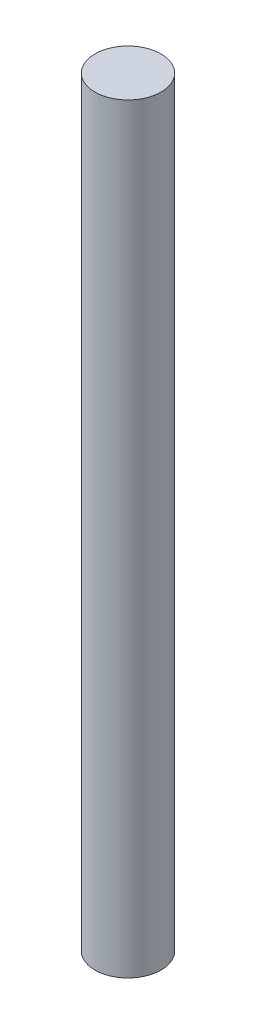
ISO-10303-21;
HEADER;
FILE_DESCRIPTION(('STEP AP214'),'2;1');
FILE_NAME('part.step','',(''),(''),'','','');
FILE_SCHEMA(('AUTOMOTIVE_DESIGN { 1 0 10303 214 1 1 1 1 }'));
ENDSEC;
DATA;
#1=APPLICATION_CONTEXT('core data for automotive mechanical design processes');
#2=APPLICATION_PROTOCOL_DEFINITION('international standard','automotive_design',2000,#1);
#3=PRODUCT_CONTEXT('',#1,'mechanical');
#4=PRODUCT('Part','Part','',(#3));
#5=PRODUCT_RELATED_PRODUCT_CATEGORY('part','',(#4));
#6=PRODUCT_DEFINITION_FORMATION('','',#4);
#7=PRODUCT_DEFINITION_CONTEXT('part definition',#1,'design');
#8=PRODUCT_DEFINITION('design','',#6,#7);
#9=PRODUCT_DEFINITION_SHAPE('','',#8);
#10=(LENGTH_UNIT() NAMED_UNIT(*) SI_UNIT(.MILLI.,.METRE.));
#11=(NAMED_UNIT(*) PLANE_ANGLE_UNIT() SI_UNIT($,.RADIAN.));
#12=(NAMED_UNIT(*) SI_UNIT($,.STERADIAN.) SOLID_ANGLE_UNIT());
#13=UNCERTAINTY_MEASURE_WITH_UNIT(LENGTH_MEASURE(1.E-05),#10,'distance_accuracy_value','');
#14=(GEOMETRIC_REPRESENTATION_CONTEXT(3) GLOBAL_UNCERTAINTY_ASSIGNED_CONTEXT((#13)) GLOBAL_UNIT_ASSIGNED_CONTEXT((#10,
#11,#12)) REPRESENTATION_CONTEXT('',''));
#15=CARTESIAN_POINT('',(0.,0.,0.));
#16=DIRECTION('',(0.,0.,1.));
#17=DIRECTION('',(1.,0.,0.));
#18=AXIS2_PLACEMENT_3D('',#15,#16,#17);
#19=CARTESIAN_POINT('',(0.,73.025,0.));
#20=DIRECTION('',(0.,-1.,0.));
#21=DIRECTION('',(0.,0.,-1.));
#22=AXIS2_PLACEMENT_3D('',#19,#20,#21);
#23=CYLINDRICAL_SURFACE('',#22,6.35);
#24=CARTESIAN_POINT('',(0.,73.025,0.));
#25=DIRECTION('',(0.,1.,0.));
#26=DIRECTION('',(0.,0.,1.));
#27=AXIS2_PLACEMENT_3D('',#24,#25,#26);
#28=CIRCLE('',#27,6.35);
#29=CARTESIAN_POINT('',(0.,73.025,6.35));
#30=VERTEX_POINT('',#29);
#31=EDGE_CURVE('E10',#30,#30,#28,.T.);
#32=ORIENTED_EDGE('',*,*,#31,.F.);
#33=EDGE_LOOP('',(#32));
#34=FACE_BOUND('',#33,.T.);
#35=CARTESIAN_POINT('',(0.,-73.025,0.));
#36=DIRECTION('',(0.,1.,0.));
#37=DIRECTION('',(0.,0.,1.));
#38=AXIS2_PLACEMENT_3D('',#35,#36,#37);
#39=CIRCLE('',#38,6.35);
#40=CARTESIAN_POINT('',(0.,-73.025,6.35));
#41=VERTEX_POINT('',#40);
#42=EDGE_CURVE('E40',#41,#41,#39,.T.);
#43=ORIENTED_EDGE('',*,*,#42,.T.);
#44=EDGE_LOOP('',(#43));
#45=FACE_BOUND('',#44,.T.);
#46=ADVANCED_FACE('F37',(#34,#45),#23,.T.);
#47=CARTESIAN_POINT('',(0.,73.025,0.));
#48=DIRECTION('',(0.,1.,0.));
#49=DIRECTION('',(0.,0.,1.));
#50=AXIS2_PLACEMENT_3D('',#47,#48,#49);
#51=PLANE('',#50);
#52=ORIENTED_EDGE('',*,*,#31,.T.);
#53=EDGE_LOOP('',(#52));
#54=FACE_BOUND('',#53,.T.);
#55=ADVANCED_FACE('F54',(#54),#51,.T.);
#56=CARTESIAN_POINT('',(0.,-73.025,0.));
#57=DIRECTION('',(0.,1.,0.));
#58=DIRECTION('',(0.,0.,1.));
#59=AXIS2_PLACEMENT_3D('',#56,#57,#58);
#60=PLANE('',#59);
#61=ORIENTED_EDGE('',*,*,#42,.F.);
#62=EDGE_LOOP('',(#61));
#63=FACE_BOUND('',#62,.T.);
#64=ADVANCED_FACE('F52',(#63),#60,.F.);
#65=CLOSED_SHELL('',(#46,#55,#64));
#66=MANIFOLD_SOLID_BREP('B2',#65);
#67=ADVANCED_BREP_SHAPE_REPRESENTATION('',(#18,#66),#14);
#68=SHAPE_DEFINITION_REPRESENTATION(#9,#67);
ENDSEC;
END-ISO-10303-21;
